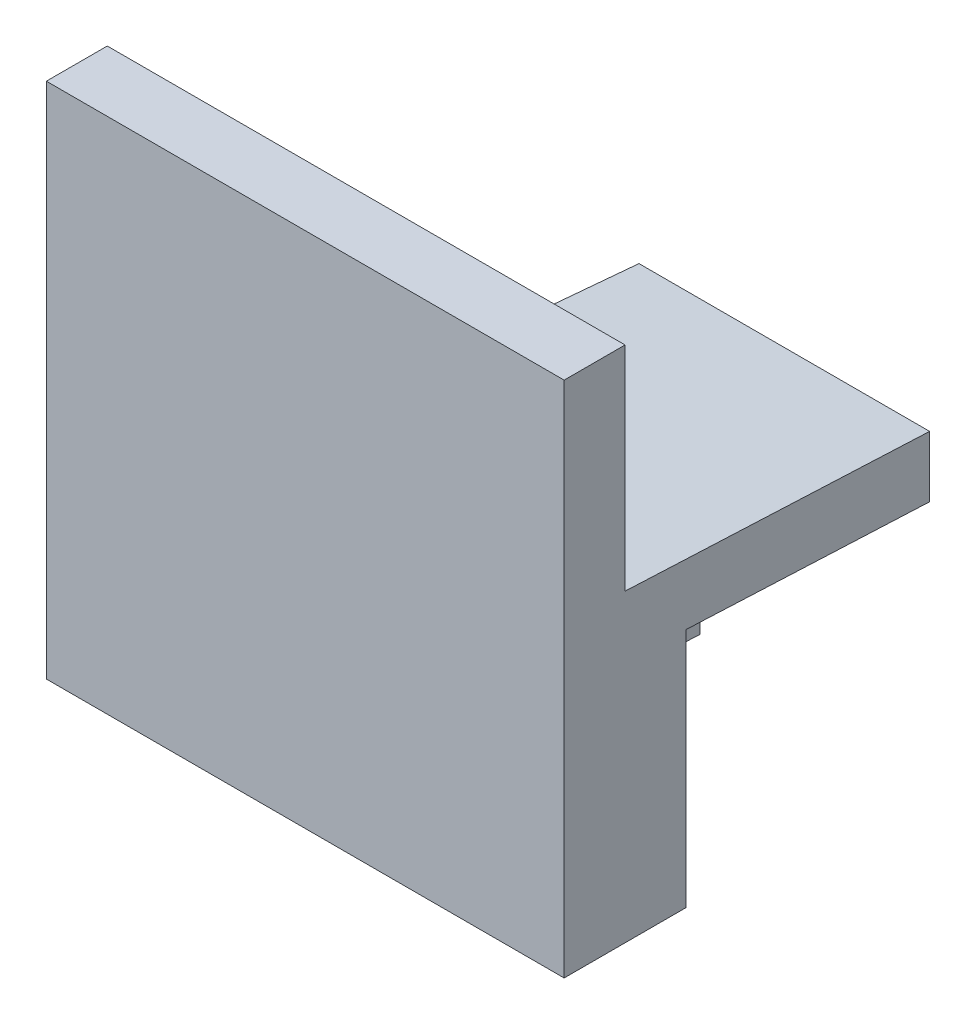
ISO-10303-21;
HEADER;
FILE_DESCRIPTION(('STEP AP214'),'2;1');
FILE_NAME('part.step','',(''),(''),'','','');
FILE_SCHEMA(('AUTOMOTIVE_DESIGN { 1 0 10303 214 1 1 1 1 }'));
ENDSEC;
DATA;
#1=APPLICATION_CONTEXT('core data for automotive mechanical design processes');
#2=APPLICATION_PROTOCOL_DEFINITION('international standard','automotive_design',2000,#1);
#3=PRODUCT_CONTEXT('',#1,'mechanical');
#4=PRODUCT('Part','Part','',(#3));
#5=PRODUCT_RELATED_PRODUCT_CATEGORY('part','',(#4));
#6=PRODUCT_DEFINITION_FORMATION('','',#4);
#7=PRODUCT_DEFINITION_CONTEXT('part definition',#1,'design');
#8=PRODUCT_DEFINITION('design','',#6,#7);
#9=PRODUCT_DEFINITION_SHAPE('','',#8);
#10=(LENGTH_UNIT() NAMED_UNIT(*) SI_UNIT(.MILLI.,.METRE.));
#11=(NAMED_UNIT(*) PLANE_ANGLE_UNIT() SI_UNIT($,.RADIAN.));
#12=(NAMED_UNIT(*) SI_UNIT($,.STERADIAN.) SOLID_ANGLE_UNIT());
#13=UNCERTAINTY_MEASURE_WITH_UNIT(LENGTH_MEASURE(1.E-05),#10,'distance_accuracy_value','');
#14=(GEOMETRIC_REPRESENTATION_CONTEXT(3) GLOBAL_UNCERTAINTY_ASSIGNED_CONTEXT((#13)) GLOBAL_UNIT_ASSIGNED_CONTEXT((#10,
#11,#12)) REPRESENTATION_CONTEXT('',''));
#15=CARTESIAN_POINT('',(0.,0.,0.));
#16=DIRECTION('',(0.,0.,1.));
#17=DIRECTION('',(1.,0.,0.));
#18=AXIS2_PLACEMENT_3D('',#15,#16,#17);
#19=CARTESIAN_POINT('',(72.5,232.5,823.999975));
#20=DIRECTION('',(0.,1.,0.));
#21=DIRECTION('',(0.,0.,1.));
#22=AXIS2_PLACEMENT_3D('',#19,#20,#21);
#23=PLANE('',#22);
#24=DIRECTION('',(-1.,0.,0.));
#25=VECTOR('',#24,1.);
#26=CARTESIAN_POINT('',(0.,232.5,864.));
#27=LINE('',#26,#25);
#28=CARTESIAN_POINT('',(72.5,232.5,864.));
#29=VERTEX_POINT('',#28);
#30=CARTESIAN_POINT('',(32.9681333295194,232.5,864.));
#31=VERTEX_POINT('',#30);
#32=EDGE_CURVE('E119',#29,#31,#27,.T.);
#33=ORIENTED_EDGE('',*,*,#32,.F.);
#34=DIRECTION('',(0.,0.,1.));
#35=VECTOR('',#34,1.);
#36=CARTESIAN_POINT('',(72.5,232.5,823.999975));
#37=LINE('',#36,#35);
#38=CARTESIAN_POINT('',(72.5,232.5,884.));
#39=VERTEX_POINT('',#38);
#40=EDGE_CURVE('E113',#29,#39,#37,.T.);
#41=ORIENTED_EDGE('',*,*,#40,.T.);
#42=DIRECTION('',(1.,0.,0.));
#43=VECTOR('',#42,1.);
#44=CARTESIAN_POINT('',(-12.5,232.5,884.));
#45=LINE('',#44,#43);
#46=CARTESIAN_POINT('',(-12.5,232.5,884.));
#47=VERTEX_POINT('',#46);
#48=EDGE_CURVE('E117',#47,#39,#45,.T.);
#49=ORIENTED_EDGE('',*,*,#48,.F.);
#50=DIRECTION('',(0.,0.,-1.));
#51=VECTOR('',#50,1.);
#52=CARTESIAN_POINT('',(-12.5,232.5,884.));
#53=LINE('',#52,#51);
#54=CARTESIAN_POINT('',(-12.5,232.5,874.));
#55=VERTEX_POINT('',#54);
#56=EDGE_CURVE('E143',#47,#55,#53,.T.);
#57=ORIENTED_EDGE('',*,*,#56,.T.);
#58=DIRECTION('',(1.,0.,0.));
#59=VECTOR('',#58,1.);
#60=CARTESIAN_POINT('',(-12.5,232.5,874.));
#61=LINE('',#60,#59);
#62=CARTESIAN_POINT('',(22.5,232.5,874.));
#63=VERTEX_POINT('',#62);
#64=EDGE_CURVE('E149',#55,#63,#61,.T.);
#65=ORIENTED_EDGE('',*,*,#64,.T.);
#66=DIRECTION('',(-0.0457187346435417,0.,0.998954351961386));
#67=VECTOR('',#66,1.);
#68=CARTESIAN_POINT('',(62.3693623314121,232.5,2.85443305864586));
#69=LINE('',#68,#67);
#70=CARTESIAN_POINT('',(24.7883295194508,232.5,824.));
#71=VERTEX_POINT('',#70);
#72=EDGE_CURVE('E11',#71,#63,#69,.T.);
#73=ORIENTED_EDGE('',*,*,#72,.F.);
#74=DIRECTION('',(-1.,0.,0.));
#75=VECTOR('',#74,1.);
#76=CARTESIAN_POINT('',(0.,232.5,824.));
#77=LINE('',#76,#75);
#78=CARTESIAN_POINT('',(34.79879694508,232.5,824.));
#79=VERTEX_POINT('',#78);
#80=EDGE_CURVE('E176',#79,#71,#77,.T.);
#81=ORIENTED_EDGE('',*,*,#80,.F.);
#82=DIRECTION('',(-0.0457187346435417,0.,0.998954351961386));
#83=VECTOR('',#82,1.);
#84=CARTESIAN_POINT('',(72.3589058510259,232.5,3.31162040508128));
#85=LINE('',#84,#83);
#86=EDGE_CURVE('E121',#79,#31,#85,.T.);
#87=ORIENTED_EDGE('',*,*,#86,.T.);
#88=EDGE_LOOP('',(#33,#41,#49,#57,#65,#73,#81,#87));
#89=FACE_BOUND('',#88,.T.);
#90=ADVANCED_FACE('F33',(#89),#23,.F.);
#91=CARTESIAN_POINT('',(0.,0.,824.));
#92=DIRECTION('',(0.,0.,1.));
#93=DIRECTION('',(1.,0.,0.));
#94=AXIS2_PLACEMENT_3D('',#91,#92,#93);
#95=PLANE('',#94);
#96=DIRECTION('',(-1.,0.,0.));
#97=VECTOR('',#96,1.);
#98=CARTESIAN_POINT('',(0.,270.20120305492,824.));
#99=LINE('',#98,#97);
#100=CARTESIAN_POINT('',(72.5,270.20120305492,824.));
#101=VERTEX_POINT('',#100);
#102=CARTESIAN_POINT('',(34.79879694508,270.20120305492,824.));
#103=VERTEX_POINT('',#102);
#104=EDGE_CURVE('E161',#101,#103,#99,.T.);
#105=ORIENTED_EDGE('',*,*,#104,.T.);
#106=DIRECTION('',(0.,-1.,0.));
#107=VECTOR('',#106,1.);
#108=CARTESIAN_POINT('',(34.79879694508,0.,824.));
#109=LINE('',#108,#107);
#110=EDGE_CURVE('E166',#103,#79,#109,.T.);
#111=ORIENTED_EDGE('',*,*,#110,.T.);
#112=ORIENTED_EDGE('',*,*,#80,.T.);
#113=DIRECTION('',(0.,-1.,0.));
#114=VECTOR('',#113,1.);
#115=CARTESIAN_POINT('',(24.7883295194508,0.,824.));
#116=LINE('',#115,#114);
#117=CARTESIAN_POINT('',(24.7883295194508,280.211670480549,824.));
#118=VERTEX_POINT('',#117);
#119=EDGE_CURVE('E178',#118,#71,#116,.T.);
#120=ORIENTED_EDGE('',*,*,#119,.F.);
#121=DIRECTION('',(-1.,0.,0.));
#122=VECTOR('',#121,1.);
#123=CARTESIAN_POINT('',(0.,280.211670480549,824.));
#124=LINE('',#123,#122);
#125=CARTESIAN_POINT('',(72.5,280.211670480549,824.));
#126=VERTEX_POINT('',#125);
#127=EDGE_CURVE('E196',#126,#118,#124,.T.);
#128=ORIENTED_EDGE('',*,*,#127,.F.);
#129=DIRECTION('',(0.,-1.,0.));
#130=VECTOR('',#129,1.);
#131=CARTESIAN_POINT('',(72.5,0.,824.));
#132=LINE('',#131,#130);
#133=EDGE_CURVE('E58',#126,#101,#132,.T.);
#134=ORIENTED_EDGE('',*,*,#133,.T.);
#135=EDGE_LOOP('',(#105,#111,#112,#120,#128,#134));
#136=FACE_BOUND('',#135,.T.);
#137=ADVANCED_FACE('F200',(#136),#95,.F.);
#138=CARTESIAN_POINT('',(62.3693623314121,0.,2.85443305864586));
#139=DIRECTION('',(0.998954351961386,0.,0.0457187346435417));
#140=DIRECTION('',(0.0457187346435417,0.,-0.998954351961386));
#141=AXIS2_PLACEMENT_3D('',#138,#139,#140);
#142=PLANE('',#141);
#143=ORIENTED_EDGE('',*,*,#119,.T.);
#144=ORIENTED_EDGE('',*,*,#72,.T.);
#145=DIRECTION('',(0.,-1.,0.));
#146=VECTOR('',#145,1.);
#147=CARTESIAN_POINT('',(22.5,282.5,874.));
#148=LINE('',#147,#146);
#149=CARTESIAN_POINT('',(22.5,282.5,874.));
#150=VERTEX_POINT('',#149);
#151=EDGE_CURVE('E190',#150,#63,#148,.T.);
#152=ORIENTED_EDGE('',*,*,#151,.F.);
#153=DIRECTION('',(-0.045671028705602,0.045671028705602,0.997911977217402));
#154=VECTOR('',#153,1.);
#155=CARTESIAN_POINT('',(62.5,242.5,0.));
#156=LINE('',#155,#154);
#157=EDGE_CURVE('E179',#118,#150,#156,.T.);
#158=ORIENTED_EDGE('',*,*,#157,.F.);
#159=EDGE_LOOP('',(#143,#144,#152,#158));
#160=FACE_BOUND('',#159,.T.);
#161=ADVANCED_FACE('F207',(#160),#142,.F.);
#162=CARTESIAN_POINT('',(0.,241.993125845879,-11.075200267546));
#163=DIRECTION('',(0.,-0.998954351961386,0.0457187346435418));
#164=DIRECTION('',(0.,-0.0457187346435418,-0.998954351961386));
#165=AXIS2_PLACEMENT_3D('',#162,#163,#164);
#166=PLANE('',#165);
#167=DIRECTION('',(-1.,0.,0.));
#168=VECTOR('',#167,1.);
#169=CARTESIAN_POINT('',(22.5,282.5,874.));
#170=LINE('',#169,#168);
#171=CARTESIAN_POINT('',(72.5,282.5,874.));
#172=VERTEX_POINT('',#171);
#173=EDGE_CURVE('E182',#172,#150,#170,.T.);
#174=ORIENTED_EDGE('',*,*,#173,.F.);
#175=DIRECTION('',(0.,-0.0457187346435417,-0.998954351961386));
#176=VECTOR('',#175,1.);
#177=CARTESIAN_POINT('',(72.5,241.993125845879,-11.075200267546));
#178=LINE('',#177,#176);
#179=EDGE_CURVE('E42',#172,#126,#178,.T.);
#180=ORIENTED_EDGE('',*,*,#179,.T.);
#181=ORIENTED_EDGE('',*,*,#127,.T.);
#182=ORIENTED_EDGE('',*,*,#157,.T.);
#183=EDGE_LOOP('',(#174,#180,#181,#182));
#184=FACE_BOUND('',#183,.T.);
#185=ADVANCED_FACE('F35',(#184),#166,.F.);
#186=CARTESIAN_POINT('',(72.5,282.5,823.999975));
#187=DIRECTION('',(-1.,0.,0.));
#188=DIRECTION('',(0.,0.,1.));
#189=AXIS2_PLACEMENT_3D('',#186,#187,#188);
#190=PLANE('',#189);
#191=DIRECTION('',(0.,-1.,0.));
#192=VECTOR('',#191,1.);
#193=CARTESIAN_POINT('',(72.5,0.,864.));
#194=LINE('',#193,#192);
#195=CARTESIAN_POINT('',(72.5,272.031866670481,864.));
#196=VERTEX_POINT('',#195);
#197=EDGE_CURVE('E167',#196,#29,#194,.T.);
#198=ORIENTED_EDGE('',*,*,#197,.F.);
#199=DIRECTION('',(0.,-0.0457187346435417,-0.998954351961386));
#200=VECTOR('',#199,1.);
#201=CARTESIAN_POINT('',(72.5,232.003582326265,-10.6180129211105));
#202=LINE('',#201,#200);
#203=EDGE_CURVE('E164',#196,#101,#202,.T.);
#204=ORIENTED_EDGE('',*,*,#203,.T.);
#205=ORIENTED_EDGE('',*,*,#133,.F.);
#206=ORIENTED_EDGE('',*,*,#179,.F.);
#207=DIRECTION('',(0.,1.,0.));
#208=VECTOR('',#207,1.);
#209=CARTESIAN_POINT('',(72.5,232.5,874.));
#210=LINE('',#209,#208);
#211=CARTESIAN_POINT('',(72.5,317.5,874.));
#212=VERTEX_POINT('',#211);
#213=EDGE_CURVE('E153',#172,#212,#210,.T.);
#214=ORIENTED_EDGE('',*,*,#213,.T.);
#215=DIRECTION('',(0.,0.,-1.));
#216=VECTOR('',#215,1.);
#217=CARTESIAN_POINT('',(72.5,317.5,884.));
#218=LINE('',#217,#216);
#219=CARTESIAN_POINT('',(72.5,317.5,884.));
#220=VERTEX_POINT('',#219);
#221=EDGE_CURVE('E127',#220,#212,#218,.T.);
#222=ORIENTED_EDGE('',*,*,#221,.F.);
#223=DIRECTION('',(0.,1.,0.));
#224=VECTOR('',#223,1.);
#225=CARTESIAN_POINT('',(72.5,232.5,884.));
#226=LINE('',#225,#224);
#227=EDGE_CURVE('E124',#39,#220,#226,.T.);
#228=ORIENTED_EDGE('',*,*,#227,.F.);
#229=ORIENTED_EDGE('',*,*,#40,.F.);
#230=EDGE_LOOP('',(#198,#204,#205,#206,#214,#222,#228,#229));
#231=FACE_BOUND('',#230,.T.);
#232=ADVANCED_FACE('F125',(#231),#190,.F.);
#233=CARTESIAN_POINT('',(0.,0.,864.));
#234=DIRECTION('',(0.,0.,1.));
#235=DIRECTION('',(1.,0.,0.));
#236=AXIS2_PLACEMENT_3D('',#233,#234,#235);
#237=PLANE('',#236);
#238=ORIENTED_EDGE('',*,*,#32,.T.);
#239=DIRECTION('',(0.,-1.,0.));
#240=VECTOR('',#239,1.);
#241=CARTESIAN_POINT('',(32.9681333295194,0.,864.));
#242=LINE('',#241,#240);
#243=CARTESIAN_POINT('',(32.9681333295194,272.031866670481,864.));
#244=VERTEX_POINT('',#243);
#245=EDGE_CURVE('E158',#244,#31,#242,.T.);
#246=ORIENTED_EDGE('',*,*,#245,.F.);
#247=DIRECTION('',(-1.,0.,0.));
#248=VECTOR('',#247,1.);
#249=CARTESIAN_POINT('',(0.,272.031866670481,864.));
#250=LINE('',#249,#248);
#251=EDGE_CURVE('E50',#196,#244,#250,.T.);
#252=ORIENTED_EDGE('',*,*,#251,.F.);
#253=ORIENTED_EDGE('',*,*,#197,.T.);
#254=EDGE_LOOP('',(#238,#246,#252,#253));
#255=FACE_BOUND('',#254,.T.);
#256=ADVANCED_FACE('F244',(#255),#237,.F.);
#257=CARTESIAN_POINT('',(72.358905851026,0.,3.31162040508128));
#258=DIRECTION('',(0.998954351961386,0.,0.0457187346435417));
#259=DIRECTION('',(0.0457187346435417,0.,-0.998954351961386));
#260=AXIS2_PLACEMENT_3D('',#257,#258,#259);
#261=PLANE('',#260);
#262=ORIENTED_EDGE('',*,*,#110,.F.);
#263=DIRECTION('',(-0.0456710287056019,0.045671028705602,0.997911977217402));
#264=VECTOR('',#263,1.);
#265=CARTESIAN_POINT('',(72.8441586169036,232.155841383096,-7.29115252934522));
#266=LINE('',#265,#264);
#267=EDGE_CURVE('E157',#103,#244,#266,.T.);
#268=ORIENTED_EDGE('',*,*,#267,.T.);
#269=ORIENTED_EDGE('',*,*,#245,.T.);
#270=ORIENTED_EDGE('',*,*,#86,.F.);
#271=EDGE_LOOP('',(#262,#268,#269,#270));
#272=FACE_BOUND('',#271,.T.);
#273=ADVANCED_FACE('F286',(#272),#261,.T.);
#274=CARTESIAN_POINT('',(0.,232.003582326265,-10.6180129211105));
#275=DIRECTION('',(0.,-0.998954351961386,0.0457187346435418));
#276=DIRECTION('',(0.,-0.0457187346435418,-0.998954351961386));
#277=AXIS2_PLACEMENT_3D('',#274,#275,#276);
#278=PLANE('',#277);
#279=ORIENTED_EDGE('',*,*,#251,.T.);
#280=ORIENTED_EDGE('',*,*,#267,.F.);
#281=ORIENTED_EDGE('',*,*,#104,.F.);
#282=ORIENTED_EDGE('',*,*,#203,.F.);
#283=EDGE_LOOP('',(#279,#280,#281,#282));
#284=FACE_BOUND('',#283,.T.);
#285=ADVANCED_FACE('F242',(#284),#278,.T.);
#286=CARTESIAN_POINT('',(0.,0.,874.));
#287=DIRECTION('',(0.,0.,1.));
#288=DIRECTION('',(1.,0.,0.));
#289=AXIS2_PLACEMENT_3D('',#286,#287,#288);
#290=PLANE('',#289);
#291=ORIENTED_EDGE('',*,*,#213,.F.);
#292=ORIENTED_EDGE('',*,*,#173,.T.);
#293=ORIENTED_EDGE('',*,*,#151,.T.);
#294=ORIENTED_EDGE('',*,*,#64,.F.);
#295=DIRECTION('',(0.,-1.,0.));
#296=VECTOR('',#295,1.);
#297=CARTESIAN_POINT('',(-12.5,317.5,874.));
#298=LINE('',#297,#296);
#299=CARTESIAN_POINT('',(-12.5,317.5,874.));
#300=VERTEX_POINT('',#299);
#301=EDGE_CURVE('E136',#300,#55,#298,.T.);
#302=ORIENTED_EDGE('',*,*,#301,.F.);
#303=DIRECTION('',(-1.,0.,0.));
#304=VECTOR('',#303,1.);
#305=CARTESIAN_POINT('',(72.5,317.5,874.));
#306=LINE('',#305,#304);
#307=EDGE_CURVE('E138',#212,#300,#306,.T.);
#308=ORIENTED_EDGE('',*,*,#307,.F.);
#309=EDGE_LOOP('',(#291,#292,#293,#294,#302,#308));
#310=FACE_BOUND('',#309,.T.);
#311=ADVANCED_FACE('F212',(#310),#290,.F.);
#312=CARTESIAN_POINT('',(72.5,317.5,884.));
#313=DIRECTION('',(0.,-1.,0.));
#314=DIRECTION('',(0.,0.,-1.));
#315=AXIS2_PLACEMENT_3D('',#312,#313,#314);
#316=PLANE('',#315);
#317=ORIENTED_EDGE('',*,*,#307,.T.);
#318=DIRECTION('',(0.,0.,-1.));
#319=VECTOR('',#318,1.);
#320=CARTESIAN_POINT('',(-12.5,317.5,884.));
#321=LINE('',#320,#319);
#322=CARTESIAN_POINT('',(-12.5,317.5,884.));
#323=VERTEX_POINT('',#322);
#324=EDGE_CURVE('E219',#323,#300,#321,.T.);
#325=ORIENTED_EDGE('',*,*,#324,.F.);
#326=DIRECTION('',(-1.,0.,0.));
#327=VECTOR('',#326,1.);
#328=CARTESIAN_POINT('',(72.5,317.5,884.));
#329=LINE('',#328,#327);
#330=EDGE_CURVE('E130',#220,#323,#329,.T.);
#331=ORIENTED_EDGE('',*,*,#330,.F.);
#332=ORIENTED_EDGE('',*,*,#221,.T.);
#333=EDGE_LOOP('',(#317,#325,#331,#332));
#334=FACE_BOUND('',#333,.T.);
#335=ADVANCED_FACE('F216',(#334),#316,.F.);
#336=CARTESIAN_POINT('',(-12.5,317.5,884.));
#337=DIRECTION('',(1.,0.,0.));
#338=DIRECTION('',(0.,1.,0.));
#339=AXIS2_PLACEMENT_3D('',#336,#337,#338);
#340=PLANE('',#339);
#341=ORIENTED_EDGE('',*,*,#301,.T.);
#342=ORIENTED_EDGE('',*,*,#56,.F.);
#343=DIRECTION('',(0.,-1.,0.));
#344=VECTOR('',#343,1.);
#345=CARTESIAN_POINT('',(-12.5,317.5,884.));
#346=LINE('',#345,#344);
#347=EDGE_CURVE('E134',#323,#47,#346,.T.);
#348=ORIENTED_EDGE('',*,*,#347,.F.);
#349=ORIENTED_EDGE('',*,*,#324,.T.);
#350=EDGE_LOOP('',(#341,#342,#348,#349));
#351=FACE_BOUND('',#350,.T.);
#352=ADVANCED_FACE('F222',(#351),#340,.F.);
#353=CARTESIAN_POINT('',(0.,0.,884.));
#354=DIRECTION('',(0.,0.,1.));
#355=DIRECTION('',(1.,0.,0.));
#356=AXIS2_PLACEMENT_3D('',#353,#354,#355);
#357=PLANE('',#356);
#358=ORIENTED_EDGE('',*,*,#48,.T.);
#359=ORIENTED_EDGE('',*,*,#227,.T.);
#360=ORIENTED_EDGE('',*,*,#330,.T.);
#361=ORIENTED_EDGE('',*,*,#347,.T.);
#362=EDGE_LOOP('',(#358,#359,#360,#361));
#363=FACE_BOUND('',#362,.T.);
#364=ADVANCED_FACE('F132',(#363),#357,.T.);
#365=CLOSED_SHELL('',(#90,#137,#161,#185,#232,#256,#273,#285,#311,#335,#352,#364));
#366=MANIFOLD_SOLID_BREP('B2',#365);
#367=ADVANCED_BREP_SHAPE_REPRESENTATION('',(#18,#366),#14);
#368=SHAPE_DEFINITION_REPRESENTATION(#9,#367);
ENDSEC;
END-ISO-10303-21;
